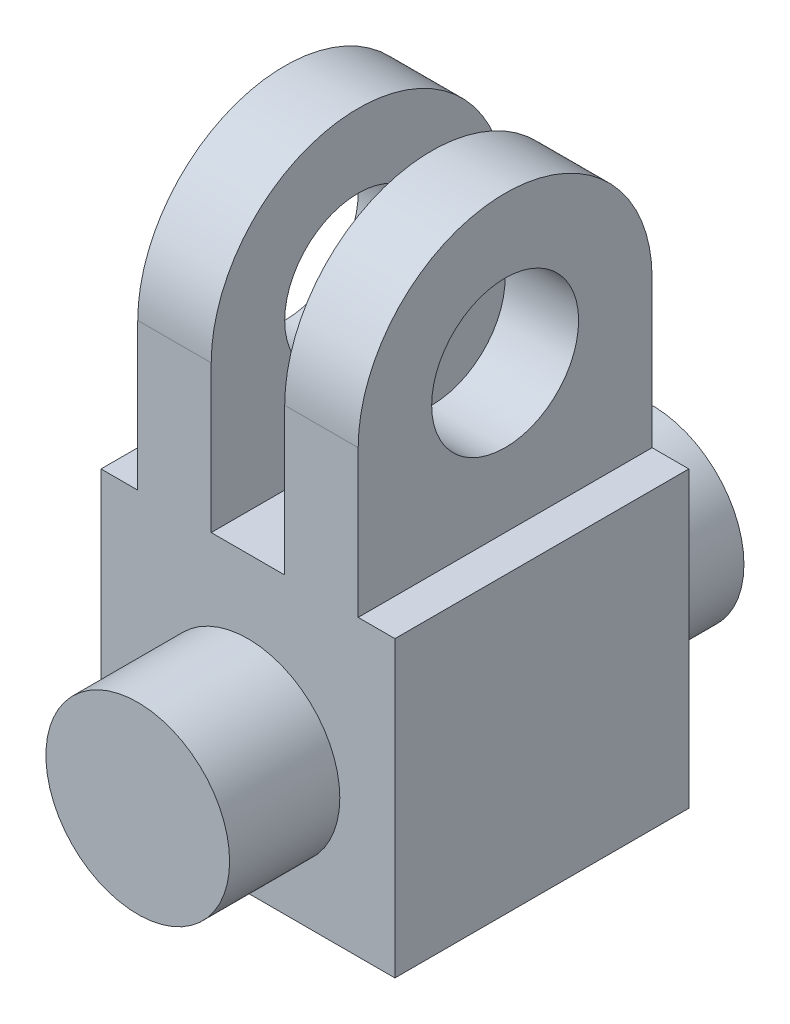
ISO-10303-21;
HEADER;
FILE_DESCRIPTION(('STEP AP214'),'2;1');
FILE_NAME('part.step','',(''),(''),'','','');
FILE_SCHEMA(('AUTOMOTIVE_DESIGN { 1 0 10303 214 1 1 1 1 }'));
ENDSEC;
DATA;
#1=APPLICATION_CONTEXT('core data for automotive mechanical design processes');
#2=APPLICATION_PROTOCOL_DEFINITION('international standard','automotive_design',2000,#1);
#3=PRODUCT_CONTEXT('',#1,'mechanical');
#4=PRODUCT('Part','Part','',(#3));
#5=PRODUCT_RELATED_PRODUCT_CATEGORY('part','',(#4));
#6=PRODUCT_DEFINITION_FORMATION('','',#4);
#7=PRODUCT_DEFINITION_CONTEXT('part definition',#1,'design');
#8=PRODUCT_DEFINITION('design','',#6,#7);
#9=PRODUCT_DEFINITION_SHAPE('','',#8);
#10=(LENGTH_UNIT() NAMED_UNIT(*) SI_UNIT(.MILLI.,.METRE.));
#11=(NAMED_UNIT(*) PLANE_ANGLE_UNIT() SI_UNIT($,.RADIAN.));
#12=(NAMED_UNIT(*) SI_UNIT($,.STERADIAN.) SOLID_ANGLE_UNIT());
#13=UNCERTAINTY_MEASURE_WITH_UNIT(LENGTH_MEASURE(1.E-05),#10,'distance_accuracy_value','');
#14=(GEOMETRIC_REPRESENTATION_CONTEXT(3) GLOBAL_UNCERTAINTY_ASSIGNED_CONTEXT((#13)) GLOBAL_UNIT_ASSIGNED_CONTEXT((#10,
#11,#12)) REPRESENTATION_CONTEXT('',''));
#15=CARTESIAN_POINT('',(0.,0.,0.));
#16=DIRECTION('',(0.,0.,1.));
#17=DIRECTION('',(1.,0.,0.));
#18=AXIS2_PLACEMENT_3D('',#15,#16,#17);
#19=CARTESIAN_POINT('',(-30.,40.,-80.));
#20=DIRECTION('',(0.,1.,0.));
#21=DIRECTION('',(0.,0.,1.));
#22=AXIS2_PLACEMENT_3D('',#19,#20,#21);
#23=PLANE('',#22);
#24=DIRECTION('',(-1.,0.,0.));
#25=VECTOR('',#24,1.);
#26=CARTESIAN_POINT('',(-30.,40.,0.));
#27=LINE('',#26,#25);
#28=CARTESIAN_POINT('',(-30.,40.,0.));
#29=VERTEX_POINT('',#28);
#30=CARTESIAN_POINT('',(-40.,40.,0.));
#31=VERTEX_POINT('',#30);
#32=EDGE_CURVE('E169',#29,#31,#27,.T.);
#33=ORIENTED_EDGE('',*,*,#32,.F.);
#34=DIRECTION('',(0.,0.,1.));
#35=VECTOR('',#34,1.);
#36=CARTESIAN_POINT('',(-30.,40.,-80.));
#37=LINE('',#36,#35);
#38=CARTESIAN_POINT('',(-30.,40.,-80.));
#39=VERTEX_POINT('',#38);
#40=EDGE_CURVE('E11',#39,#29,#37,.T.);
#41=ORIENTED_EDGE('',*,*,#40,.F.);
#42=DIRECTION('',(-1.,0.,0.));
#43=VECTOR('',#42,1.);
#44=CARTESIAN_POINT('',(-30.,40.,-80.));
#45=LINE('',#44,#43);
#46=CARTESIAN_POINT('',(-40.,40.,-80.));
#47=VERTEX_POINT('',#46);
#48=EDGE_CURVE('E213',#39,#47,#45,.T.);
#49=ORIENTED_EDGE('',*,*,#48,.T.);
#50=DIRECTION('',(0.,0.,1.));
#51=VECTOR('',#50,1.);
#52=CARTESIAN_POINT('',(-40.,40.,-80.));
#53=LINE('',#52,#51);
#54=EDGE_CURVE('E105',#47,#31,#53,.T.);
#55=ORIENTED_EDGE('',*,*,#54,.T.);
#56=EDGE_LOOP('',(#33,#41,#49,#55));
#57=FACE_BOUND('',#56,.T.);
#58=ADVANCED_FACE('F39',(#57),#23,.T.);
#59=CARTESIAN_POINT('',(-30.,40.,-80.));
#60=DIRECTION('',(-1.,0.,0.));
#61=DIRECTION('',(0.,-1.,0.));
#62=AXIS2_PLACEMENT_3D('',#59,#60,#61);
#63=PLANE('',#62);
#64=CARTESIAN_POINT('',(-30.,80.,-40.));
#65=DIRECTION('',(-1.,0.,0.));
#66=DIRECTION('',(0.,-1.,0.));
#67=AXIS2_PLACEMENT_3D('',#64,#65,#66);
#68=CIRCLE('',#67,20.);
#69=CARTESIAN_POINT('',(-30.,60.,-40.));
#70=VERTEX_POINT('',#69);
#71=EDGE_CURVE('E464',#70,#70,#68,.T.);
#72=ORIENTED_EDGE('',*,*,#71,.F.);
#73=EDGE_LOOP('',(#72));
#74=FACE_BOUND('',#73,.T.);
#75=DIRECTION('',(0.,-1.,0.));
#76=VECTOR('',#75,1.);
#77=CARTESIAN_POINT('',(-30.,40.,0.));
#78=LINE('',#77,#76);
#79=CARTESIAN_POINT('',(-30.,80.,0.));
#80=VERTEX_POINT('',#79);
#81=EDGE_CURVE('E210',#80,#29,#78,.T.);
#82=ORIENTED_EDGE('',*,*,#81,.F.);
#83=CARTESIAN_POINT('',(-30.,80.,-40.));
#84=DIRECTION('',(-1.,0.,0.));
#85=DIRECTION('',(0.,1.,0.));
#86=AXIS2_PLACEMENT_3D('',#83,#84,#85);
#87=CIRCLE('',#86,40.);
#88=CARTESIAN_POINT('',(-30.,80.,-80.));
#89=VERTEX_POINT('',#88);
#90=EDGE_CURVE('E93',#80,#89,#87,.T.);
#91=ORIENTED_EDGE('',*,*,#90,.T.);
#92=DIRECTION('',(0.,-1.,0.));
#93=VECTOR('',#92,1.);
#94=CARTESIAN_POINT('',(-30.,40.,-80.));
#95=LINE('',#94,#93);
#96=EDGE_CURVE('E166',#89,#39,#95,.T.);
#97=ORIENTED_EDGE('',*,*,#96,.T.);
#98=ORIENTED_EDGE('',*,*,#40,.T.);
#99=EDGE_LOOP('',(#82,#91,#97,#98));
#100=FACE_BOUND('',#99,.T.);
#101=ADVANCED_FACE('F232',(#74,#100),#63,.T.);
#102=CARTESIAN_POINT('',(-10.,80.,-80.));
#103=DIRECTION('',(1.,0.,0.));
#104=DIRECTION('',(0.,1.,0.));
#105=AXIS2_PLACEMENT_3D('',#102,#103,#104);
#106=PLANE('',#105);
#107=CARTESIAN_POINT('',(-10.,80.,-40.));
#108=DIRECTION('',(1.,0.,0.));
#109=DIRECTION('',(0.,1.,0.));
#110=AXIS2_PLACEMENT_3D('',#107,#108,#109);
#111=CIRCLE('',#110,20.);
#112=CARTESIAN_POINT('',(-10.,100.,-40.));
#113=VERTEX_POINT('',#112);
#114=EDGE_CURVE('E239',#113,#113,#111,.T.);
#115=ORIENTED_EDGE('',*,*,#114,.F.);
#116=EDGE_LOOP('',(#115));
#117=FACE_BOUND('',#116,.T.);
#118=DIRECTION('',(0.,1.,0.));
#119=VECTOR('',#118,1.);
#120=CARTESIAN_POINT('',(-10.,80.,0.));
#121=LINE('',#120,#119);
#122=CARTESIAN_POINT('',(-9.99999999999999,40.,0.));
#123=VERTEX_POINT('',#122);
#124=CARTESIAN_POINT('',(-10.,80.,0.));
#125=VERTEX_POINT('',#124);
#126=EDGE_CURVE('E203',#123,#125,#121,.T.);
#127=ORIENTED_EDGE('',*,*,#126,.F.);
#128=DIRECTION('',(0.,0.,1.));
#129=VECTOR('',#128,1.);
#130=CARTESIAN_POINT('',(-9.99999999999999,40.,-80.));
#131=LINE('',#130,#129);
#132=CARTESIAN_POINT('',(-9.99999999999999,40.,-80.));
#133=VERTEX_POINT('',#132);
#134=EDGE_CURVE('E49',#133,#123,#131,.T.);
#135=ORIENTED_EDGE('',*,*,#134,.F.);
#136=DIRECTION('',(0.,1.,0.));
#137=VECTOR('',#136,1.);
#138=CARTESIAN_POINT('',(-10.,80.,-80.));
#139=LINE('',#138,#137);
#140=CARTESIAN_POINT('',(-10.,80.,-80.));
#141=VERTEX_POINT('',#140);
#142=EDGE_CURVE('E146',#133,#141,#139,.T.);
#143=ORIENTED_EDGE('',*,*,#142,.T.);
#144=CARTESIAN_POINT('',(-10.,80.,-40.));
#145=DIRECTION('',(-1.,0.,0.));
#146=DIRECTION('',(0.,1.,0.));
#147=AXIS2_PLACEMENT_3D('',#144,#145,#146);
#148=CIRCLE('',#147,40.);
#149=EDGE_CURVE('E238',#125,#141,#148,.T.);
#150=ORIENTED_EDGE('',*,*,#149,.F.);
#151=EDGE_LOOP('',(#127,#135,#143,#150));
#152=FACE_BOUND('',#151,.T.);
#153=ADVANCED_FACE('F320',(#117,#152),#106,.T.);
#154=CARTESIAN_POINT('',(9.99999999999999,40.,-80.));
#155=DIRECTION('',(0.,1.,0.));
#156=DIRECTION('',(0.,0.,1.));
#157=AXIS2_PLACEMENT_3D('',#154,#155,#156);
#158=PLANE('',#157);
#159=DIRECTION('',(-1.,0.,0.));
#160=VECTOR('',#159,1.);
#161=CARTESIAN_POINT('',(9.99999999999999,40.,0.));
#162=LINE('',#161,#160);
#163=CARTESIAN_POINT('',(9.99999999999999,40.,0.));
#164=VERTEX_POINT('',#163);
#165=EDGE_CURVE('E130',#164,#123,#162,.T.);
#166=ORIENTED_EDGE('',*,*,#165,.F.);
#167=DIRECTION('',(0.,0.,1.));
#168=VECTOR('',#167,1.);
#169=CARTESIAN_POINT('',(9.99999999999999,40.,-80.));
#170=LINE('',#169,#168);
#171=CARTESIAN_POINT('',(9.99999999999999,40.,-80.));
#172=VERTEX_POINT('',#171);
#173=EDGE_CURVE('E125',#172,#164,#170,.T.);
#174=ORIENTED_EDGE('',*,*,#173,.F.);
#175=DIRECTION('',(-1.,0.,0.));
#176=VECTOR('',#175,1.);
#177=CARTESIAN_POINT('',(9.99999999999999,40.,-80.));
#178=LINE('',#177,#176);
#179=EDGE_CURVE('E128',#172,#133,#178,.T.);
#180=ORIENTED_EDGE('',*,*,#179,.T.);
#181=ORIENTED_EDGE('',*,*,#134,.T.);
#182=EDGE_LOOP('',(#166,#174,#180,#181));
#183=FACE_BOUND('',#182,.T.);
#184=ADVANCED_FACE('F127',(#183),#158,.T.);
#185=CARTESIAN_POINT('',(10.,80.,-80.));
#186=DIRECTION('',(-1.,0.,0.));
#187=DIRECTION('',(0.,-1.,0.));
#188=AXIS2_PLACEMENT_3D('',#185,#186,#187);
#189=PLANE('',#188);
#190=CARTESIAN_POINT('',(10.,80.,-40.));
#191=DIRECTION('',(-1.,0.,0.));
#192=DIRECTION('',(0.,-1.,0.));
#193=AXIS2_PLACEMENT_3D('',#190,#191,#192);
#194=CIRCLE('',#193,20.);
#195=CARTESIAN_POINT('',(10.,60.,-40.));
#196=VERTEX_POINT('',#195);
#197=EDGE_CURVE('E471',#196,#196,#194,.T.);
#198=ORIENTED_EDGE('',*,*,#197,.F.);
#199=EDGE_LOOP('',(#198));
#200=FACE_BOUND('',#199,.T.);
#201=DIRECTION('',(0.,-1.,0.));
#202=VECTOR('',#201,1.);
#203=CARTESIAN_POINT('',(10.,80.,0.));
#204=LINE('',#203,#202);
#205=CARTESIAN_POINT('',(10.,80.,0.));
#206=VERTEX_POINT('',#205);
#207=EDGE_CURVE('E198',#206,#164,#204,.T.);
#208=ORIENTED_EDGE('',*,*,#207,.F.);
#209=CARTESIAN_POINT('',(10.,80.,-40.));
#210=DIRECTION('',(1.,0.,0.));
#211=DIRECTION('',(0.,-1.,0.));
#212=AXIS2_PLACEMENT_3D('',#209,#210,#211);
#213=CIRCLE('',#212,40.);
#214=CARTESIAN_POINT('',(10.,80.,-80.));
#215=VERTEX_POINT('',#214);
#216=EDGE_CURVE('E151',#215,#206,#213,.T.);
#217=ORIENTED_EDGE('',*,*,#216,.F.);
#218=DIRECTION('',(0.,-1.,0.));
#219=VECTOR('',#218,1.);
#220=CARTESIAN_POINT('',(10.,80.,-80.));
#221=LINE('',#220,#219);
#222=EDGE_CURVE('E143',#215,#172,#221,.T.);
#223=ORIENTED_EDGE('',*,*,#222,.T.);
#224=ORIENTED_EDGE('',*,*,#173,.T.);
#225=EDGE_LOOP('',(#208,#217,#223,#224));
#226=FACE_BOUND('',#225,.T.);
#227=ADVANCED_FACE('F150',(#200,#226),#189,.T.);
#228=CARTESIAN_POINT('',(30.,40.,-80.));
#229=DIRECTION('',(1.,0.,0.));
#230=DIRECTION('',(0.,1.,0.));
#231=AXIS2_PLACEMENT_3D('',#228,#229,#230);
#232=PLANE('',#231);
#233=CARTESIAN_POINT('',(30.,80.,-40.));
#234=DIRECTION('',(1.,0.,0.));
#235=DIRECTION('',(0.,1.,0.));
#236=AXIS2_PLACEMENT_3D('',#233,#234,#235);
#237=CIRCLE('',#236,20.);
#238=CARTESIAN_POINT('',(30.,100.,-40.));
#239=VERTEX_POINT('',#238);
#240=EDGE_CURVE('E42',#239,#239,#237,.T.);
#241=ORIENTED_EDGE('',*,*,#240,.F.);
#242=EDGE_LOOP('',(#241));
#243=FACE_BOUND('',#242,.T.);
#244=DIRECTION('',(0.,1.,0.));
#245=VECTOR('',#244,1.);
#246=CARTESIAN_POINT('',(30.,40.,0.));
#247=LINE('',#246,#245);
#248=CARTESIAN_POINT('',(30.,40.,0.));
#249=VERTEX_POINT('',#248);
#250=CARTESIAN_POINT('',(30.,80.,0.));
#251=VERTEX_POINT('',#250);
#252=EDGE_CURVE('E190',#249,#251,#247,.T.);
#253=ORIENTED_EDGE('',*,*,#252,.F.);
#254=DIRECTION('',(0.,0.,1.));
#255=VECTOR('',#254,1.);
#256=CARTESIAN_POINT('',(30.,40.,-80.));
#257=LINE('',#256,#255);
#258=CARTESIAN_POINT('',(30.,40.,-80.));
#259=VERTEX_POINT('',#258);
#260=EDGE_CURVE('E136',#259,#249,#257,.T.);
#261=ORIENTED_EDGE('',*,*,#260,.F.);
#262=DIRECTION('',(0.,1.,0.));
#263=VECTOR('',#262,1.);
#264=CARTESIAN_POINT('',(30.,40.,-80.));
#265=LINE('',#264,#263);
#266=CARTESIAN_POINT('',(30.,80.,-80.));
#267=VERTEX_POINT('',#266);
#268=EDGE_CURVE('E157',#259,#267,#265,.T.);
#269=ORIENTED_EDGE('',*,*,#268,.T.);
#270=CARTESIAN_POINT('',(30.,80.,-40.));
#271=DIRECTION('',(1.,0.,0.));
#272=DIRECTION('',(0.,-1.,0.));
#273=AXIS2_PLACEMENT_3D('',#270,#271,#272);
#274=CIRCLE('',#273,40.);
#275=EDGE_CURVE('E270',#267,#251,#274,.T.);
#276=ORIENTED_EDGE('',*,*,#275,.T.);
#277=EDGE_LOOP('',(#253,#261,#269,#276));
#278=FACE_BOUND('',#277,.T.);
#279=ADVANCED_FACE('F267',(#243,#278),#232,.T.);
#280=CARTESIAN_POINT('',(40.,40.,-80.));
#281=DIRECTION('',(0.,1.,0.));
#282=DIRECTION('',(-1.,0.,0.));
#283=AXIS2_PLACEMENT_3D('',#280,#281,#282);
#284=PLANE('',#283);
#285=DIRECTION('',(-1.,0.,0.));
#286=VECTOR('',#285,1.);
#287=CARTESIAN_POINT('',(40.,40.,0.));
#288=LINE('',#287,#286);
#289=CARTESIAN_POINT('',(40.,40.,0.));
#290=VERTEX_POINT('',#289);
#291=EDGE_CURVE('E186',#290,#249,#288,.T.);
#292=ORIENTED_EDGE('',*,*,#291,.F.);
#293=DIRECTION('',(0.,0.,1.));
#294=VECTOR('',#293,1.);
#295=CARTESIAN_POINT('',(40.,40.,-80.));
#296=LINE('',#295,#294);
#297=CARTESIAN_POINT('',(40.,40.,-80.));
#298=VERTEX_POINT('',#297);
#299=EDGE_CURVE('E219',#298,#290,#296,.T.);
#300=ORIENTED_EDGE('',*,*,#299,.F.);
#301=DIRECTION('',(-1.,0.,0.));
#302=VECTOR('',#301,1.);
#303=CARTESIAN_POINT('',(40.,40.,-80.));
#304=LINE('',#303,#302);
#305=EDGE_CURVE('E258',#298,#259,#304,.T.);
#306=ORIENTED_EDGE('',*,*,#305,.T.);
#307=ORIENTED_EDGE('',*,*,#260,.T.);
#308=EDGE_LOOP('',(#292,#300,#306,#307));
#309=FACE_BOUND('',#308,.T.);
#310=ADVANCED_FACE('F275',(#309),#284,.T.);
#311=CARTESIAN_POINT('',(40.,-40.,-80.));
#312=DIRECTION('',(1.,0.,0.));
#313=DIRECTION('',(0.,0.,-1.));
#314=AXIS2_PLACEMENT_3D('',#311,#312,#313);
#315=PLANE('',#314);
#316=DIRECTION('',(0.,1.,0.));
#317=VECTOR('',#316,1.);
#318=CARTESIAN_POINT('',(40.,-40.,0.));
#319=LINE('',#318,#317);
#320=CARTESIAN_POINT('',(40.,-40.,0.));
#321=VERTEX_POINT('',#320);
#322=EDGE_CURVE('E182',#321,#290,#319,.T.);
#323=ORIENTED_EDGE('',*,*,#322,.F.);
#324=DIRECTION('',(0.,0.,1.));
#325=VECTOR('',#324,1.);
#326=CARTESIAN_POINT('',(40.,-40.,-80.));
#327=LINE('',#326,#325);
#328=CARTESIAN_POINT('',(40.,-40.,-80.));
#329=VERTEX_POINT('',#328);
#330=EDGE_CURVE('E222',#329,#321,#327,.T.);
#331=ORIENTED_EDGE('',*,*,#330,.F.);
#332=DIRECTION('',(0.,1.,0.));
#333=VECTOR('',#332,1.);
#334=CARTESIAN_POINT('',(40.,-40.,-80.));
#335=LINE('',#334,#333);
#336=EDGE_CURVE('E254',#329,#298,#335,.T.);
#337=ORIENTED_EDGE('',*,*,#336,.T.);
#338=ORIENTED_EDGE('',*,*,#299,.T.);
#339=EDGE_LOOP('',(#323,#331,#337,#338));
#340=FACE_BOUND('',#339,.T.);
#341=ADVANCED_FACE('F278',(#340),#315,.T.);
#342=CARTESIAN_POINT('',(40.,-40.,-80.));
#343=DIRECTION('',(0.,-1.,0.));
#344=DIRECTION('',(0.,0.,-1.));
#345=AXIS2_PLACEMENT_3D('',#342,#343,#344);
#346=PLANE('',#345);
#347=DIRECTION('',(1.,0.,0.));
#348=VECTOR('',#347,1.);
#349=CARTESIAN_POINT('',(40.,-40.,0.));
#350=LINE('',#349,#348);
#351=CARTESIAN_POINT('',(-40.,-40.,0.));
#352=VERTEX_POINT('',#351);
#353=EDGE_CURVE('E178',#352,#321,#350,.T.);
#354=ORIENTED_EDGE('',*,*,#353,.F.);
#355=DIRECTION('',(0.,0.,1.));
#356=VECTOR('',#355,1.);
#357=CARTESIAN_POINT('',(-40.,-40.,-80.));
#358=LINE('',#357,#356);
#359=CARTESIAN_POINT('',(-40.,-40.,-80.));
#360=VERTEX_POINT('',#359);
#361=EDGE_CURVE('E225',#360,#352,#358,.T.);
#362=ORIENTED_EDGE('',*,*,#361,.F.);
#363=DIRECTION('',(1.,0.,0.));
#364=VECTOR('',#363,1.);
#365=CARTESIAN_POINT('',(40.,-40.,-80.));
#366=LINE('',#365,#364);
#367=EDGE_CURVE('E246',#360,#329,#366,.T.);
#368=ORIENTED_EDGE('',*,*,#367,.T.);
#369=ORIENTED_EDGE('',*,*,#330,.T.);
#370=EDGE_LOOP('',(#354,#362,#368,#369));
#371=FACE_BOUND('',#370,.T.);
#372=ADVANCED_FACE('F280',(#371),#346,.T.);
#373=CARTESIAN_POINT('',(-40.,-40.,-80.));
#374=DIRECTION('',(-1.,0.,0.));
#375=DIRECTION('',(0.,0.,1.));
#376=AXIS2_PLACEMENT_3D('',#373,#374,#375);
#377=PLANE('',#376);
#378=DIRECTION('',(0.,-1.,0.));
#379=VECTOR('',#378,1.);
#380=CARTESIAN_POINT('',(-40.,-40.,0.));
#381=LINE('',#380,#379);
#382=EDGE_CURVE('E173',#31,#352,#381,.T.);
#383=ORIENTED_EDGE('',*,*,#382,.F.);
#384=ORIENTED_EDGE('',*,*,#54,.F.);
#385=DIRECTION('',(0.,-1.,0.));
#386=VECTOR('',#385,1.);
#387=CARTESIAN_POINT('',(-40.,-40.,-80.));
#388=LINE('',#387,#386);
#389=EDGE_CURVE('E242',#47,#360,#388,.T.);
#390=ORIENTED_EDGE('',*,*,#389,.T.);
#391=ORIENTED_EDGE('',*,*,#361,.T.);
#392=EDGE_LOOP('',(#383,#384,#390,#391));
#393=FACE_BOUND('',#392,.T.);
#394=ADVANCED_FACE('F228',(#393),#377,.T.);
#395=CARTESIAN_POINT('',(0.,0.,-80.));
#396=DIRECTION('',(0.,0.,-1.));
#397=DIRECTION('',(-1.,0.,0.));
#398=AXIS2_PLACEMENT_3D('',#395,#396,#397);
#399=PLANE('',#398);
#400=CARTESIAN_POINT('',(0.,-4.99999999999998,-80.));
#401=DIRECTION('',(0.,0.,-1.));
#402=DIRECTION('',(-1.,0.,0.));
#403=AXIS2_PLACEMENT_3D('',#400,#401,#402);
#404=CIRCLE('',#403,25.);
#405=CARTESIAN_POINT('',(-25.,-4.99999999999998,-80.));
#406=VERTEX_POINT('',#405);
#407=EDGE_CURVE('E458',#406,#406,#404,.T.);
#408=ORIENTED_EDGE('',*,*,#407,.F.);
#409=EDGE_LOOP('',(#408));
#410=FACE_BOUND('',#409,.T.);
#411=ORIENTED_EDGE('',*,*,#48,.F.);
#412=ORIENTED_EDGE('',*,*,#96,.F.);
#413=DIRECTION('',(-1.,0.,0.));
#414=VECTOR('',#413,1.);
#415=CARTESIAN_POINT('',(-30.,80.,-80.));
#416=LINE('',#415,#414);
#417=EDGE_CURVE('E163',#141,#89,#416,.T.);
#418=ORIENTED_EDGE('',*,*,#417,.F.);
#419=ORIENTED_EDGE('',*,*,#142,.F.);
#420=ORIENTED_EDGE('',*,*,#179,.F.);
#421=ORIENTED_EDGE('',*,*,#222,.F.);
#422=DIRECTION('',(-1.,0.,0.));
#423=VECTOR('',#422,1.);
#424=CARTESIAN_POINT('',(30.,80.,-80.));
#425=LINE('',#424,#423);
#426=EDGE_CURVE('E153',#267,#215,#425,.T.);
#427=ORIENTED_EDGE('',*,*,#426,.F.);
#428=ORIENTED_EDGE('',*,*,#268,.F.);
#429=ORIENTED_EDGE('',*,*,#305,.F.);
#430=ORIENTED_EDGE('',*,*,#336,.F.);
#431=ORIENTED_EDGE('',*,*,#367,.F.);
#432=ORIENTED_EDGE('',*,*,#389,.F.);
#433=EDGE_LOOP('',(#411,#412,#418,#419,#420,#421,#427,#428,#429,#430,#431,#432));
#434=FACE_BOUND('',#433,.T.);
#435=ADVANCED_FACE('F141',(#410,#434),#399,.T.);
#436=CARTESIAN_POINT('',(0.,0.,0.));
#437=DIRECTION('',(0.,0.,-1.));
#438=DIRECTION('',(-1.,0.,0.));
#439=AXIS2_PLACEMENT_3D('',#436,#437,#438);
#440=PLANE('',#439);
#441=CARTESIAN_POINT('',(0.,-4.99999999999998,0.));
#442=DIRECTION('',(0.,0.,1.));
#443=DIRECTION('',(1.,0.,0.));
#444=AXIS2_PLACEMENT_3D('',#441,#442,#443);
#445=CIRCLE('',#444,25.);
#446=CARTESIAN_POINT('',(25.,-4.99999999999998,0.));
#447=VERTEX_POINT('',#446);
#448=EDGE_CURVE('E174',#447,#447,#445,.T.);
#449=ORIENTED_EDGE('',*,*,#448,.F.);
#450=EDGE_LOOP('',(#449));
#451=FACE_BOUND('',#450,.T.);
#452=ORIENTED_EDGE('',*,*,#32,.T.);
#453=ORIENTED_EDGE('',*,*,#382,.T.);
#454=ORIENTED_EDGE('',*,*,#353,.T.);
#455=ORIENTED_EDGE('',*,*,#322,.T.);
#456=ORIENTED_EDGE('',*,*,#291,.T.);
#457=ORIENTED_EDGE('',*,*,#252,.T.);
#458=DIRECTION('',(-1.,0.,0.));
#459=VECTOR('',#458,1.);
#460=CARTESIAN_POINT('',(30.,80.,0.));
#461=LINE('',#460,#459);
#462=EDGE_CURVE('E194',#251,#206,#461,.T.);
#463=ORIENTED_EDGE('',*,*,#462,.T.);
#464=ORIENTED_EDGE('',*,*,#207,.T.);
#465=ORIENTED_EDGE('',*,*,#165,.T.);
#466=ORIENTED_EDGE('',*,*,#126,.T.);
#467=DIRECTION('',(-1.,0.,0.));
#468=VECTOR('',#467,1.);
#469=CARTESIAN_POINT('',(-30.,80.,0.));
#470=LINE('',#469,#468);
#471=EDGE_CURVE('E207',#125,#80,#470,.T.);
#472=ORIENTED_EDGE('',*,*,#471,.T.);
#473=ORIENTED_EDGE('',*,*,#81,.T.);
#474=EDGE_LOOP('',(#452,#453,#454,#455,#456,#457,#463,#464,#465,#466,#472,#473));
#475=FACE_BOUND('',#474,.T.);
#476=ADVANCED_FACE('F231',(#451,#475),#440,.F.);
#477=CARTESIAN_POINT('',(10.,80.,-40.));
#478=DIRECTION('',(1.,0.,0.));
#479=DIRECTION('',(0.,1.,0.));
#480=AXIS2_PLACEMENT_3D('',#477,#478,#479);
#481=CYLINDRICAL_SURFACE('',#480,40.);
#482=ORIENTED_EDGE('',*,*,#275,.F.);
#483=ORIENTED_EDGE('',*,*,#426,.T.);
#484=ORIENTED_EDGE('',*,*,#216,.T.);
#485=ORIENTED_EDGE('',*,*,#462,.F.);
#486=EDGE_LOOP('',(#482,#483,#484,#485));
#487=FACE_BOUND('',#486,.T.);
#488=ADVANCED_FACE('F306',(#487),#481,.T.);
#489=CARTESIAN_POINT('',(-10.,80.,-40.));
#490=DIRECTION('',(-1.,0.,0.));
#491=DIRECTION('',(0.,-1.,0.));
#492=AXIS2_PLACEMENT_3D('',#489,#490,#491);
#493=CYLINDRICAL_SURFACE('',#492,40.);
#494=ORIENTED_EDGE('',*,*,#90,.F.);
#495=ORIENTED_EDGE('',*,*,#471,.F.);
#496=ORIENTED_EDGE('',*,*,#149,.T.);
#497=ORIENTED_EDGE('',*,*,#417,.T.);
#498=EDGE_LOOP('',(#494,#495,#496,#497));
#499=FACE_BOUND('',#498,.T.);
#500=ADVANCED_FACE('F289',(#499),#493,.T.);
#501=CARTESIAN_POINT('',(40.,80.,-40.));
#502=DIRECTION('',(-1.,0.,0.));
#503=DIRECTION('',(0.,-1.,0.));
#504=AXIS2_PLACEMENT_3D('',#501,#502,#503);
#505=CYLINDRICAL_SURFACE('',#504,20.);
#506=ORIENTED_EDGE('',*,*,#197,.T.);
#507=EDGE_LOOP('',(#506));
#508=FACE_BOUND('',#507,.T.);
#509=ORIENTED_EDGE('',*,*,#240,.T.);
#510=EDGE_LOOP('',(#509));
#511=FACE_BOUND('',#510,.T.);
#512=ADVANCED_FACE('F367',(#508,#511),#505,.F.);
#513=ORIENTED_EDGE('',*,*,#114,.T.);
#514=EDGE_LOOP('',(#513));
#515=FACE_BOUND('',#514,.T.);
#516=ORIENTED_EDGE('',*,*,#71,.T.);
#517=EDGE_LOOP('',(#516));
#518=FACE_BOUND('',#517,.T.);
#519=ADVANCED_FACE('F402',(#515,#518),#505,.F.);
#520=CARTESIAN_POINT('',(0.,-4.99999999999998,30.));
#521=DIRECTION('',(0.,0.,1.));
#522=DIRECTION('',(1.,0.,0.));
#523=AXIS2_PLACEMENT_3D('',#520,#521,#522);
#524=PLANE('',#523);
#525=CARTESIAN_POINT('',(0.,-4.99999999999998,30.));
#526=DIRECTION('',(0.,0.,1.));
#527=DIRECTION('',(1.,0.,0.));
#528=AXIS2_PLACEMENT_3D('',#525,#526,#527);
#529=CIRCLE('',#528,25.);
#530=CARTESIAN_POINT('',(25.,-4.99999999999998,30.));
#531=VERTEX_POINT('',#530);
#532=EDGE_CURVE('E459',#531,#531,#529,.T.);
#533=ORIENTED_EDGE('',*,*,#532,.T.);
#534=EDGE_LOOP('',(#533));
#535=FACE_BOUND('',#534,.T.);
#536=ADVANCED_FACE('F412',(#535),#524,.T.);
#537=CARTESIAN_POINT('',(0.,-4.99999999999998,-110.));
#538=DIRECTION('',(0.,0.,1.));
#539=DIRECTION('',(1.,0.,0.));
#540=AXIS2_PLACEMENT_3D('',#537,#538,#539);
#541=CYLINDRICAL_SURFACE('',#540,25.);
#542=ORIENTED_EDGE('',*,*,#532,.F.);
#543=EDGE_LOOP('',(#542));
#544=FACE_BOUND('',#543,.T.);
#545=ORIENTED_EDGE('',*,*,#448,.T.);
#546=EDGE_LOOP('',(#545));
#547=FACE_BOUND('',#546,.T.);
#548=ADVANCED_FACE('F303',(#544,#547),#541,.T.);
#549=ORIENTED_EDGE('',*,*,#407,.T.);
#550=EDGE_LOOP('',(#549));
#551=FACE_BOUND('',#550,.T.);
#552=CARTESIAN_POINT('',(0.,-4.99999999999998,-110.));
#553=DIRECTION('',(0.,0.,1.));
#554=DIRECTION('',(1.,0.,0.));
#555=AXIS2_PLACEMENT_3D('',#552,#553,#554);
#556=CIRCLE('',#555,25.);
#557=CARTESIAN_POINT('',(25.,-4.99999999999998,-110.));
#558=VERTEX_POINT('',#557);
#559=EDGE_CURVE('E455',#558,#558,#556,.T.);
#560=ORIENTED_EDGE('',*,*,#559,.T.);
#561=EDGE_LOOP('',(#560));
#562=FACE_BOUND('',#561,.T.);
#563=ADVANCED_FACE('F430',(#551,#562),#541,.T.);
#564=CARTESIAN_POINT('',(0.,-4.99999999999998,-110.));
#565=DIRECTION('',(0.,0.,1.));
#566=DIRECTION('',(1.,0.,0.));
#567=AXIS2_PLACEMENT_3D('',#564,#565,#566);
#568=PLANE('',#567);
#569=ORIENTED_EDGE('',*,*,#559,.F.);
#570=EDGE_LOOP('',(#569));
#571=FACE_BOUND('',#570,.T.);
#572=ADVANCED_FACE('F440',(#571),#568,.F.);
#573=CLOSED_SHELL('',(#58,#101,#153,#184,#227,#279,#310,#341,#372,#394,#435,#476,#488,#500,#512,
#519,#536,#548,#563,#572));
#574=MANIFOLD_SOLID_BREP('B2',#573);
#575=ADVANCED_BREP_SHAPE_REPRESENTATION('',(#18,#574),#14);
#576=SHAPE_DEFINITION_REPRESENTATION(#9,#575);
ENDSEC;
END-ISO-10303-21;
